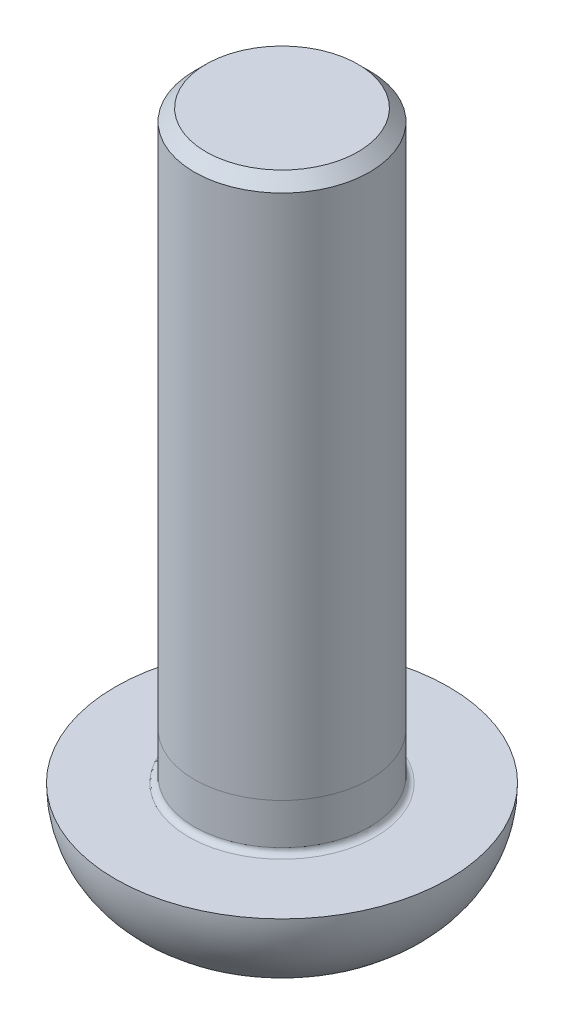
ISO-10303-21;
HEADER;
FILE_DESCRIPTION(('STEP AP214'),'2;1');
FILE_NAME('part.step','',(''),(''),'','','');
FILE_SCHEMA(('AUTOMOTIVE_DESIGN { 1 0 10303 214 1 1 1 1 }'));
ENDSEC;
DATA;
#1=APPLICATION_CONTEXT('core data for automotive mechanical design processes');
#2=APPLICATION_PROTOCOL_DEFINITION('international standard','automotive_design',2000,#1);
#3=PRODUCT_CONTEXT('',#1,'mechanical');
#4=PRODUCT('Part','Part','',(#3));
#5=PRODUCT_RELATED_PRODUCT_CATEGORY('part','',(#4));
#6=PRODUCT_DEFINITION_FORMATION('','',#4);
#7=PRODUCT_DEFINITION_CONTEXT('part definition',#1,'design');
#8=PRODUCT_DEFINITION('design','',#6,#7);
#9=PRODUCT_DEFINITION_SHAPE('','',#8);
#10=(LENGTH_UNIT() NAMED_UNIT(*) SI_UNIT(.MILLI.,.METRE.));
#11=(NAMED_UNIT(*) PLANE_ANGLE_UNIT() SI_UNIT($,.RADIAN.));
#12=(NAMED_UNIT(*) SI_UNIT($,.STERADIAN.) SOLID_ANGLE_UNIT());
#13=UNCERTAINTY_MEASURE_WITH_UNIT(LENGTH_MEASURE(1.E-05),#10,'distance_accuracy_value','');
#14=(GEOMETRIC_REPRESENTATION_CONTEXT(3) GLOBAL_UNCERTAINTY_ASSIGNED_CONTEXT((#13)) GLOBAL_UNIT_ASSIGNED_CONTEXT((#10,
#11,#12)) REPRESENTATION_CONTEXT('',''));
#15=CARTESIAN_POINT('',(0.,0.,0.));
#16=DIRECTION('',(0.,0.,1.));
#17=DIRECTION('',(1.,0.,0.));
#18=AXIS2_PLACEMENT_3D('',#15,#16,#17);
#19=CARTESIAN_POINT('',(0.,0.,0.));
#20=DIRECTION('',(0.,1.,0.));
#21=DIRECTION('',(0.,0.,1.));
#22=AXIS2_PLACEMENT_3D('',#19,#20,#21);
#23=CYLINDRICAL_SURFACE('',#22,1.5);
#24=CARTESIAN_POINT('',(0.,9.8,0.));
#25=DIRECTION('',(0.,1.,0.));
#26=DIRECTION('',(0.,0.,1.));
#27=AXIS2_PLACEMENT_3D('',#24,#25,#26);
#28=CIRCLE('',#27,1.5);
#29=CARTESIAN_POINT('',(0.,9.8,1.5));
#30=VERTEX_POINT('',#29);
#31=EDGE_CURVE('E28',#30,#30,#28,.F.);
#32=ORIENTED_EDGE('',*,*,#31,.T.);
#33=EDGE_LOOP('',(#32));
#34=FACE_BOUND('',#33,.T.);
#35=CARTESIAN_POINT('',(0.,0.8,0.));
#36=DIRECTION('',(0.,1.,0.));
#37=DIRECTION('',(0.,0.,1.));
#38=AXIS2_PLACEMENT_3D('',#35,#36,#37);
#39=CIRCLE('',#38,1.5);
#40=CARTESIAN_POINT('',(0.,0.8,1.5));
#41=VERTEX_POINT('',#40);
#42=EDGE_CURVE('E11',#41,#41,#39,.T.);
#43=ORIENTED_EDGE('',*,*,#42,.T.);
#44=EDGE_LOOP('',(#43));
#45=FACE_BOUND('',#44,.T.);
#46=ADVANCED_FACE('F18',(#34,#45),#23,.T.);
#47=ORIENTED_EDGE('',*,*,#42,.F.);
#48=EDGE_LOOP('',(#47));
#49=FACE_BOUND('',#48,.T.);
#50=CARTESIAN_POINT('',(0.,0.1,0.));
#51=DIRECTION('',(0.,1.,0.));
#52=DIRECTION('',(0.,0.,1.));
#53=AXIS2_PLACEMENT_3D('',#50,#51,#52);
#54=CIRCLE('',#53,1.5);
#55=CARTESIAN_POINT('',(0.,0.1,1.5));
#56=VERTEX_POINT('',#55);
#57=EDGE_CURVE('E280',#56,#56,#54,.T.);
#58=ORIENTED_EDGE('',*,*,#57,.T.);
#59=EDGE_LOOP('',(#58));
#60=FACE_BOUND('',#59,.T.);
#61=ADVANCED_FACE('F192',(#49,#60),#23,.T.);
#62=CARTESIAN_POINT('',(2.85,0.,0.));
#63=DIRECTION('',(0.,1.,0.));
#64=DIRECTION('',(0.,0.,1.));
#65=AXIS2_PLACEMENT_3D('',#62,#63,#64);
#66=PLANE('',#65);
#67=CARTESIAN_POINT('',(0.,0.,0.));
#68=DIRECTION('',(0.,1.,0.));
#69=DIRECTION('',(0.,0.,1.));
#70=AXIS2_PLACEMENT_3D('',#67,#68,#69);
#71=CIRCLE('',#70,1.6);
#72=CARTESIAN_POINT('',(0.,0.,1.6));
#73=VERTEX_POINT('',#72);
#74=EDGE_CURVE('E277',#73,#73,#71,.F.);
#75=ORIENTED_EDGE('',*,*,#74,.T.);
#76=EDGE_LOOP('',(#75));
#77=FACE_BOUND('',#76,.T.);
#78=CARTESIAN_POINT('',(0.,0.,0.));
#79=DIRECTION('',(0.,1.,0.));
#80=DIRECTION('',(0.,0.,1.));
#81=AXIS2_PLACEMENT_3D('',#78,#79,#80);
#82=CIRCLE('',#81,2.85);
#83=CARTESIAN_POINT('',(0.,0.,2.85));
#84=VERTEX_POINT('',#83);
#85=EDGE_CURVE('E108',#84,#84,#82,.T.);
#86=ORIENTED_EDGE('',*,*,#85,.T.);
#87=EDGE_LOOP('',(#86));
#88=FACE_BOUND('',#87,.T.);
#89=ADVANCED_FACE('F199',(#77,#88),#66,.T.);
#90=CARTESIAN_POINT('',(0.,10.,0.));
#91=DIRECTION('',(0.,1.,0.));
#92=DIRECTION('',(0.,0.,1.));
#93=AXIS2_PLACEMENT_3D('',#90,#91,#92);
#94=PLANE('',#93);
#95=CARTESIAN_POINT('',(0.,10.,0.));
#96=DIRECTION('',(0.,1.,0.));
#97=DIRECTION('',(0.,0.,1.));
#98=AXIS2_PLACEMENT_3D('',#95,#96,#97);
#99=CIRCLE('',#98,1.3);
#100=CARTESIAN_POINT('',(0.,10.,1.3));
#101=VERTEX_POINT('',#100);
#102=EDGE_CURVE('E282',#101,#101,#99,.T.);
#103=ORIENTED_EDGE('',*,*,#102,.T.);
#104=EDGE_LOOP('',(#103));
#105=FACE_BOUND('',#104,.T.);
#106=ADVANCED_FACE('F227',(#105),#94,.T.);
#107=CARTESIAN_POINT('',(0.,0.1,0.));
#108=DIRECTION('',(0.,1.,0.));
#109=DIRECTION('',(0.,0.,1.));
#110=AXIS2_PLACEMENT_3D('',#107,#108,#109);
#111=TOROIDAL_SURFACE('',#110,1.6,0.1);
#112=ORIENTED_EDGE('',*,*,#74,.F.);
#113=EDGE_LOOP('',(#112));
#114=FACE_BOUND('',#113,.T.);
#115=ORIENTED_EDGE('',*,*,#57,.F.);
#116=EDGE_LOOP('',(#115));
#117=FACE_BOUND('',#116,.T.);
#118=ADVANCED_FACE('F265',(#114,#117),#111,.F.);
#119=CARTESIAN_POINT('',(0.,10.,0.));
#120=DIRECTION('',(0.,-1.,0.));
#121=DIRECTION('',(0.,0.,-1.));
#122=AXIS2_PLACEMENT_3D('',#119,#120,#121);
#123=CONICAL_SURFACE('',#122,1.3,0.785398163397448);
#124=ORIENTED_EDGE('',*,*,#31,.F.);
#125=EDGE_LOOP('',(#124));
#126=FACE_BOUND('',#125,.T.);
#127=ORIENTED_EDGE('',*,*,#102,.F.);
#128=EDGE_LOOP('',(#127));
#129=FACE_BOUND('',#128,.T.);
#130=ADVANCED_FACE('F21',(#126,#129),#123,.T.);
#131=CARTESIAN_POINT('',(0.,0.,0.));
#132=DIRECTION('',(0.,-1.,0.));
#133=DIRECTION('',(0.,0.,-1.));
#134=AXIS2_PLACEMENT_3D('',#131,#132,#133);
#135=DEGENERATE_TOROIDAL_SURFACE('',#134,1.15723309668695,1.69276690331305,.T.);
#136=ORIENTED_EDGE('',*,*,#85,.F.);
#137=EDGE_LOOP('',(#136));
#138=FACE_BOUND('',#137,.T.);
#139=CARTESIAN_POINT('',(0.,-1.65,0.));
#140=DIRECTION('',(0.,-1.,0.));
#141=DIRECTION('',(0.,0.,-1.));
#142=AXIS2_PLACEMENT_3D('',#139,#140,#141);
#143=CIRCLE('',#142,1.53533333333333);
#144=CARTESIAN_POINT('',(0.,-1.65,-1.53533333333333));
#145=VERTEX_POINT('',#144);
#146=EDGE_CURVE('E119',#145,#145,#143,.T.);
#147=ORIENTED_EDGE('',*,*,#146,.F.);
#148=EDGE_LOOP('',(#147));
#149=FACE_BOUND('',#148,.T.);
#150=ADVANCED_FACE('F143',(#138,#149),#135,.T.);
#151=CARTESIAN_POINT('',(0.,0.343493969566669,0.));
#152=DIRECTION('',(0.,-1.,0.));
#153=DIRECTION('',(0.,0.,-1.));
#154=AXIS2_PLACEMENT_3D('',#151,#152,#153);
#155=CONICAL_SURFACE('',#154,0.,1.0471975511966);
#156=CARTESIAN_POINT('',(0.,0.343493969566668,0.));
#157=VERTEX_POINT('',#156);
#158=VERTEX_LOOP('',#157);
#159=FACE_BOUND('',#158,.T.);
#160=CARTESIAN_POINT('',(-0.57723479913579,-0.323239373765666,1.0002));
#161=CARTESIAN_POINT('',(-0.60260779582055,-0.308581670749146,0.95625268060172));
#162=CARTESIAN_POINT('',(-0.62819980753166,-0.295250420720894,0.911926016050179));
#163=CARTESIAN_POINT('',(-0.679827098330834,-0.271979204723454,0.822504925328877));
#164=CARTESIAN_POINT('',(-0.705863295614161,-0.262047473649781,0.777408908798268));
#165=CARTESIAN_POINT('',(-0.757612978088371,-0.246585391982078,0.68777582947738));
#166=CARTESIAN_POINT('',(-0.783318495222186,-0.240952165198952,0.643252567766779));
#167=CARTESIAN_POINT('',(-0.834850648373674,-0.234223985740253,0.55399626028498));
#168=CARTESIAN_POINT('',(-0.860677096749783,-0.233123465021663,0.509263539518502));
#169=CARTESIAN_POINT('',(-0.908946264126692,-0.235397749398137,0.42565888918265));
#170=CARTESIAN_POINT('',(-0.93139616328756,-0.238214135963409,0.386774523211231));
#171=CARTESIAN_POINT('',(-0.976149681982096,-0.247145147317349,0.309259155014812));
#172=CARTESIAN_POINT('',(-0.998453146411454,-0.253262830854298,0.270628421438359));
#173=CARTESIAN_POINT('',(-1.04329913914046,-0.268558422825822,0.192952883515854));
#174=CARTESIAN_POINT('',(-1.0658359836813,-0.277801249268959,0.153917923728832));
#175=CARTESIAN_POINT('',(-1.11057330008463,-0.298779542855529,0.0764306187239881));
#176=CARTESIAN_POINT('',(-1.13277434629517,-0.310510072233662,0.0379772787061411));
#177=CARTESIAN_POINT('',(-1.15481600843309,-0.323239373765666,-0.000199999999999968));
#178=B_SPLINE_CURVE_WITH_KNOTS('',3,(#160,#161,#162,#163,#164,#165,#166,#167,#168,#169,#170,
#171,#172,#173,#174,#175,#176,#177),.UNSPECIFIED.,.F.,.F.,(4,2,2,2,2,2,2,2,4),(0.,
0.158523820030116,0.317428970089344,0.472400167924636,0.627180939971652,0.762016584872713,
0.896977373984234,1.03493410168667,1.17261952416172),.UNSPECIFIED.);
#179=CARTESIAN_POINT('',(-0.577350269189628,-0.323172697100001,1.));
#180=VERTEX_POINT('',#179);
#181=CARTESIAN_POINT('',(-1.15470053837925,-0.3231726971,0.));
#182=VERTEX_POINT('',#181);
#183=EDGE_CURVE('E231',#180,#182,#178,.T.);
#184=ORIENTED_EDGE('',*,*,#183,.T.);
#185=CARTESIAN_POINT('',(-1.15481600843309,-0.323239373765666,0.000199999999999951));
#186=CARTESIAN_POINT('',(-1.12944301174833,-0.308581670749144,-0.0437473193982796));
#187=CARTESIAN_POINT('',(-1.10385100003722,-0.295250420720892,-0.0880739839498199));
#188=CARTESIAN_POINT('',(-1.05222370923805,-0.271979204723451,-0.177495074671121));
#189=CARTESIAN_POINT('',(-1.02618751195472,-0.262047473649778,-0.222591091201731));
#190=CARTESIAN_POINT('',(-0.974437829480509,-0.246585391982075,-0.312224170522618));
#191=CARTESIAN_POINT('',(-0.948732312346693,-0.240952165198949,-0.356747432233219));
#192=CARTESIAN_POINT('',(-0.897200159195205,-0.23422398574025,-0.446003739715017));
#193=CARTESIAN_POINT('',(-0.871373710819096,-0.233123465021662,-0.490736460481494));
#194=CARTESIAN_POINT('',(-0.823104543442187,-0.235397749398135,-0.574341110817346));
#195=CARTESIAN_POINT('',(-0.800654644281319,-0.238214135963406,-0.613225476788766));
#196=CARTESIAN_POINT('',(-0.755901125586783,-0.247145147317346,-0.690740844985186));
#197=CARTESIAN_POINT('',(-0.733597661157425,-0.253262830854295,-0.729371578561639));
#198=CARTESIAN_POINT('',(-0.688751668428417,-0.268558422825819,-0.807047116484145));
#199=CARTESIAN_POINT('',(-0.666214823887573,-0.277801249268956,-0.846082076271168));
#200=CARTESIAN_POINT('',(-0.621477507484248,-0.298779542855526,-0.923569381276012));
#201=CARTESIAN_POINT('',(-0.599276461273703,-0.31051007223366,-0.962022721293859));
#202=CARTESIAN_POINT('',(-0.577234799135786,-0.323239373765665,-1.0002));
#203=B_SPLINE_CURVE_WITH_KNOTS('',3,(#185,#186,#187,#188,#189,#190,#191,#192,#193,#194,#195,
#196,#197,#198,#199,#200,#201,#202),.UNSPECIFIED.,.F.,.F.,(4,2,2,2,2,2,2,2,4),(0.,
0.158523820030116,0.317428970089343,0.472400167924633,0.627180939971648,0.762016584872712,
0.896977373984234,1.03493410168667,1.17261952416172),.UNSPECIFIED.);
#204=CARTESIAN_POINT('',(-0.577350269189624,-0.323172697099999,-1.));
#205=VERTEX_POINT('',#204);
#206=EDGE_CURVE('E210',#182,#205,#203,.T.);
#207=ORIENTED_EDGE('',*,*,#206,.T.);
#208=CARTESIAN_POINT('',(-2.07504286794707,-0.986393607613955,-1.));
#209=CARTESIAN_POINT('',(-2.02682279106524,-0.961316377407704,-1.));
#210=CARTESIAN_POINT('',(-1.97853691004541,-0.936364946741178,-1.));
#211=CARTESIAN_POINT('',(-1.8818030933017,-0.886774929008181,-1.));
#212=CARTESIAN_POINT('',(-1.83335515294731,-0.862136350978961,-1.));
#213=CARTESIAN_POINT('',(-1.68757772249328,-0.788708866319357,-1.));
#214=CARTESIAN_POINT('',(-1.58996247918061,-0.740485578372843,-1.));
#215=CARTESIAN_POINT('',(-1.38815097133191,-0.643689275610979,-1.));
#216=CARTESIAN_POINT('',(-1.28389118372582,-0.595246614822795,-1.));
#217=CARTESIAN_POINT('',(-1.1261124150131,-0.525795403790139,-1.));
#218=CARTESIAN_POINT('',(-1.07330104577001,-0.503185593765542,-1.));
#219=CARTESIAN_POINT('',(-0.967092503842049,-0.459392656354955,-1.));
#220=CARTESIAN_POINT('',(-0.913695388590406,-0.438209390522896,-1.));
#221=CARTESIAN_POINT('',(-0.799511927621137,-0.395225105347771,-1.));
#222=CARTESIAN_POINT('',(-0.738630513241441,-0.373673326648714,-1.));
#223=CARTESIAN_POINT('',(-0.615756898059116,-0.333895444872872,-1.));
#224=CARTESIAN_POINT('',(-0.55376448427185,-0.315669987124044,-1.));
#225=CARTESIAN_POINT('',(-0.429844956310903,-0.284132130395532,-1.));
#226=CARTESIAN_POINT('',(-0.367941892041247,-0.270727798477079,-0.999999999999999));
#227=CARTESIAN_POINT('',(-0.243186894330264,-0.249688967026314,-1.));
#228=CARTESIAN_POINT('',(-0.180335941994431,-0.242048870164089,-1.));
#229=CARTESIAN_POINT('',(-0.053117087212335,-0.23350346812294,-1.));
#230=CARTESIAN_POINT('',(0.0112587802010998,-0.232710778814144,-0.999999999999999));
#231=CARTESIAN_POINT('',(0.139698917999479,-0.238286345523692,-0.999999999999998));
#232=CARTESIAN_POINT('',(0.203763108167843,-0.244656356253859,-0.999999999999999));
#233=CARTESIAN_POINT('',(0.332282815414209,-0.263811380961667,-0.999999999999998));
#234=CARTESIAN_POINT('',(0.396717517990757,-0.276730366285534,-0.999999999999997));
#235=CARTESIAN_POINT('',(0.524373111070633,-0.307555063618328,-0.999999999999998));
#236=CARTESIAN_POINT('',(0.587593448223018,-0.325462993903571,-1.));
#237=CARTESIAN_POINT('',(0.714393281642094,-0.365369534566214,-1.));
#238=CARTESIAN_POINT('',(0.777944283333139,-0.387456844695104,-0.999999999999998));
#239=CARTESIAN_POINT('',(0.904055464216809,-0.434321064000253,-0.999999999999996));
#240=CARTESIAN_POINT('',(0.966615314988617,-0.459098844162117,-0.999999999999997));
#241=CARTESIAN_POINT('',(1.09101415590376,-0.510600578339333,-0.999999999999997));
#242=CARTESIAN_POINT('',(1.15285213540842,-0.537326951700803,-0.999999999999997));
#243=CARTESIAN_POINT('',(1.27590834026243,-0.592172327957835,-0.999999999999996));
#244=CARTESIAN_POINT('',(1.33712652584108,-0.620291419547209,-0.999999999999996));
#245=CARTESIAN_POINT('',(1.45527281806991,-0.675772911385423,-0.999999999999996));
#246=CARTESIAN_POINT('',(1.51223028309753,-0.703073061852557,-0.999999999999996));
#247=CARTESIAN_POINT('',(1.62580762087008,-0.75837113173608,-0.999999999999996));
#248=CARTESIAN_POINT('',(1.68242747958521,-0.786369079903627,-0.999999999999995));
#249=CARTESIAN_POINT('',(1.79517357157368,-0.842797054453244,-0.999999999999995));
#250=CARTESIAN_POINT('',(1.85130086971277,-0.871224958202004,-0.999999999999994));
#251=CARTESIAN_POINT('',(1.96332854560562,-0.928511693589308,-0.999999999999995));
#252=CARTESIAN_POINT('',(2.01922894445415,-0.957370483944579,-0.999999999999997));
#253=CARTESIAN_POINT('',(2.07504286794707,-0.986393607613955,-1.));
#254=B_SPLINE_CURVE_WITH_KNOTS('',3,(#208,#209,#210,#211,#212,#213,#214,#215,#216,#217,#218,
#219,#220,#221,#222,#223,#224,#225,#226,#227,#228,#229,#230,#231,#232,#233,#234,#235,#236,#237,
#238,#239,#240,#241,#242,#243,#244,#245,#246,#247,#248,#249,#250,#251,#252,#253),.UNSPECIFIED.,
.F.,.F.,(4,2,2,2,2,2,2,2,2,2,2,2,2,2,2,2,2,2,2,2,2,2,4),(0.,0.163053590937593,0.326111881273646,
0.652729035927794,0.997553167692492,1.16988107477401,1.34219223326344,1.53587473946493,
1.72959478148545,1.9193958400875,2.10901235532177,2.3017415782982,2.49451802619509,
2.69140757197867,2.88838480251726,3.09014067143475,3.29196205059307,3.49403842158144,
3.6961276781817,3.88560815647294,4.07509645482261,4.26384234904605,4.45257027410017),.UNSPECIFIED.);
#255=CARTESIAN_POINT('',(0.577350269189627,-0.323172697099999,-1.));
#256=VERTEX_POINT('',#255);
#257=EDGE_CURVE('E106',#205,#256,#254,.T.);
#258=ORIENTED_EDGE('',*,*,#257,.T.);
#259=CARTESIAN_POINT('',(0.577234799135789,-0.323239373765664,-1.0002));
#260=CARTESIAN_POINT('',(0.602607795820549,-0.308581670749144,-0.95625268060172));
#261=CARTESIAN_POINT('',(0.628199807531659,-0.295250420720892,-0.91192601605018));
#262=CARTESIAN_POINT('',(0.679827098330832,-0.271979204723452,-0.822504925328878));
#263=CARTESIAN_POINT('',(0.705863295614159,-0.262047473649779,-0.777408908798268));
#264=CARTESIAN_POINT('',(0.757612978088369,-0.246585391982076,-0.687775829477381));
#265=CARTESIAN_POINT('',(0.783318495222185,-0.24095216519895,-0.64325256776678));
#266=CARTESIAN_POINT('',(0.834850648373672,-0.234223985740251,-0.553996260284982));
#267=CARTESIAN_POINT('',(0.860677096749781,-0.233123465021662,-0.509263539518504));
#268=CARTESIAN_POINT('',(0.90894626412669,-0.235397749398136,-0.425658889182652));
#269=CARTESIAN_POINT('',(0.931396163287558,-0.238214135963407,-0.386774523211232));
#270=CARTESIAN_POINT('',(0.976149681982095,-0.247145147317348,-0.309259155014813));
#271=CARTESIAN_POINT('',(0.998453146411452,-0.253262830854298,-0.27062842143836));
#272=CARTESIAN_POINT('',(1.04329913914046,-0.268558422825821,-0.192952883515854));
#273=CARTESIAN_POINT('',(1.0658359836813,-0.277801249268958,-0.153917923728831));
#274=CARTESIAN_POINT('',(1.11057330008463,-0.298779542855528,-0.0764306187239868));
#275=CARTESIAN_POINT('',(1.13277434629517,-0.310510072233661,-0.0379772787061394));
#276=CARTESIAN_POINT('',(1.15481600843309,-0.323239373765666,0.000200000000001659));
#277=B_SPLINE_CURVE_WITH_KNOTS('',3,(#259,#260,#261,#262,#263,#264,#265,#266,#267,#268,#269,
#270,#271,#272,#273,#274,#275,#276),.UNSPECIFIED.,.F.,.F.,(4,2,2,2,2,2,2,2,4),(0.,
0.158523820030116,0.317428970089343,0.472400167924634,0.627180939971649,0.762016584872712,
0.896977373984234,1.03493410168667,1.17261952416172),.UNSPECIFIED.);
#278=CARTESIAN_POINT('',(1.15470053837925,-0.3231726971,0.));
#279=VERTEX_POINT('',#278);
#280=EDGE_CURVE('E255',#256,#279,#277,.T.);
#281=ORIENTED_EDGE('',*,*,#280,.T.);
#282=CARTESIAN_POINT('',(1.15481600843309,-0.323239373765666,-0.000199999999998299));
#283=CARTESIAN_POINT('',(1.12944301174833,-0.308581670749145,0.0437473193982811));
#284=CARTESIAN_POINT('',(1.10385100003722,-0.295250420720892,0.0880739839498212));
#285=CARTESIAN_POINT('',(1.05222370923805,-0.271979204723452,0.177495074671123));
#286=CARTESIAN_POINT('',(1.02618751195472,-0.262047473649779,0.222591091201732));
#287=CARTESIAN_POINT('',(0.974437829480509,-0.246585391982076,0.31222417052262));
#288=CARTESIAN_POINT('',(0.948732312346694,-0.240952165198951,0.356747432233221));
#289=CARTESIAN_POINT('',(0.897200159195205,-0.234223985740251,0.446003739715018));
#290=CARTESIAN_POINT('',(0.871373710819094,-0.233123465021662,0.490736460481495));
#291=CARTESIAN_POINT('',(0.823104543442185,-0.235397749398136,0.574341110817347));
#292=CARTESIAN_POINT('',(0.800654644281318,-0.238214135963407,0.613225476788768));
#293=CARTESIAN_POINT('',(0.755901125586783,-0.247145147317348,0.690740844985188));
#294=CARTESIAN_POINT('',(0.733597661157425,-0.253262830854297,0.729371578561641));
#295=CARTESIAN_POINT('',(0.688751668428417,-0.268558422825821,0.807047116484147));
#296=CARTESIAN_POINT('',(0.666214823887573,-0.277801249268958,0.846082076271169));
#297=CARTESIAN_POINT('',(0.621477507484247,-0.298779542855529,0.923569381276014));
#298=CARTESIAN_POINT('',(0.599276461273702,-0.310510072233662,0.96202272129386));
#299=CARTESIAN_POINT('',(0.577234799135783,-0.323239373765666,1.0002));
#300=B_SPLINE_CURVE_WITH_KNOTS('',3,(#282,#283,#284,#285,#286,#287,#288,#289,#290,#291,#292,
#293,#294,#295,#296,#297,#298,#299),.UNSPECIFIED.,.F.,.F.,(4,2,2,2,2,2,2,2,4),(0.,
0.158523820030116,0.317428970089343,0.472400167924634,0.627180939971649,0.762016584872712,
0.896977373984235,1.03493410168667,1.17261952416172),.UNSPECIFIED.);
#301=CARTESIAN_POINT('',(0.577350269189621,-0.323172697100001,1.));
#302=VERTEX_POINT('',#301);
#303=EDGE_CURVE('E249',#279,#302,#300,.T.);
#304=ORIENTED_EDGE('',*,*,#303,.T.);
#305=CARTESIAN_POINT('',(2.07504286794707,-0.986393607613953,1.));
#306=CARTESIAN_POINT('',(2.02682279106523,-0.961316377407702,1.));
#307=CARTESIAN_POINT('',(1.97853691004541,-0.936364946741176,1.));
#308=CARTESIAN_POINT('',(1.8818030933017,-0.886774929008179,1.));
#309=CARTESIAN_POINT('',(1.83335515294731,-0.862136350978959,1.));
#310=CARTESIAN_POINT('',(1.68757772249327,-0.788708866319355,1.));
#311=CARTESIAN_POINT('',(1.58996247918061,-0.740485578372841,1.));
#312=CARTESIAN_POINT('',(1.3881509713319,-0.643689275610978,1.));
#313=CARTESIAN_POINT('',(1.28389118372581,-0.595246614822793,1.));
#314=CARTESIAN_POINT('',(1.12611241501309,-0.525795403790138,1.));
#315=CARTESIAN_POINT('',(1.07330104577001,-0.503185593765541,1.));
#316=CARTESIAN_POINT('',(0.967092503842044,-0.459392656354954,1.));
#317=CARTESIAN_POINT('',(0.9136953885904,-0.438209390522895,1.));
#318=CARTESIAN_POINT('',(0.799511927621131,-0.39522510534777,1.));
#319=CARTESIAN_POINT('',(0.738630513241435,-0.373673326648713,1.));
#320=CARTESIAN_POINT('',(0.615756898059109,-0.333895444872871,1.));
#321=CARTESIAN_POINT('',(0.553764484271844,-0.315669987124044,1.));
#322=CARTESIAN_POINT('',(0.429844956310896,-0.284132130395532,1.));
#323=CARTESIAN_POINT('',(0.36794189204124,-0.270727798477079,0.999999999999999));
#324=CARTESIAN_POINT('',(0.243186894330257,-0.249688967026315,1.));
#325=CARTESIAN_POINT('',(0.180335941994423,-0.24204887016409,1.));
#326=CARTESIAN_POINT('',(0.0531170872123265,-0.233503468122942,1.));
#327=CARTESIAN_POINT('',(-0.0112587802011085,-0.232710778814146,0.999999999999999));
#328=CARTESIAN_POINT('',(-0.139698917999488,-0.238286345523695,0.999999999999998));
#329=CARTESIAN_POINT('',(-0.203763108167852,-0.244656356253862,0.999999999999999));
#330=CARTESIAN_POINT('',(-0.332282815414218,-0.26381138096167,0.999999999999998));
#331=CARTESIAN_POINT('',(-0.396717517990766,-0.276730366285537,0.999999999999997));
#332=CARTESIAN_POINT('',(-0.524373111070641,-0.307555063618332,0.999999999999998));
#333=CARTESIAN_POINT('',(-0.587593448223027,-0.325462993903575,1.));
#334=CARTESIAN_POINT('',(-0.714393281642102,-0.365369534566218,1.));
#335=CARTESIAN_POINT('',(-0.777944283333146,-0.387456844695108,0.999999999999998));
#336=CARTESIAN_POINT('',(-0.904055464216816,-0.434321064000257,0.999999999999996));
#337=CARTESIAN_POINT('',(-0.966615314988624,-0.459098844162121,0.999999999999997));
#338=CARTESIAN_POINT('',(-1.09101415590376,-0.510600578339336,0.999999999999997));
#339=CARTESIAN_POINT('',(-1.15285213540842,-0.537326951700806,0.999999999999997));
#340=CARTESIAN_POINT('',(-1.27590834026244,-0.592172327957838,0.999999999999996));
#341=CARTESIAN_POINT('',(-1.33712652584108,-0.620291419547212,0.999999999999996));
#342=CARTESIAN_POINT('',(-1.45527281806991,-0.675772911385425,0.999999999999996));
#343=CARTESIAN_POINT('',(-1.51223028309753,-0.703073061852559,0.999999999999996));
#344=CARTESIAN_POINT('',(-1.62580762087008,-0.758371131736082,0.999999999999996));
#345=CARTESIAN_POINT('',(-1.68242747958521,-0.786369079903628,0.999999999999995));
#346=CARTESIAN_POINT('',(-1.79517357157368,-0.842797054453244,0.999999999999995));
#347=CARTESIAN_POINT('',(-1.85130086971277,-0.871224958202004,0.999999999999994));
#348=CARTESIAN_POINT('',(-1.96332854560562,-0.928511693589307,0.999999999999995));
#349=CARTESIAN_POINT('',(-2.01922894445415,-0.957370483944578,0.999999999999997));
#350=CARTESIAN_POINT('',(-2.07504286794707,-0.986393607613954,1.));
#351=B_SPLINE_CURVE_WITH_KNOTS('',3,(#305,#306,#307,#308,#309,#310,#311,#312,#313,#314,#315,
#316,#317,#318,#319,#320,#321,#322,#323,#324,#325,#326,#327,#328,#329,#330,#331,#332,#333,#334,
#335,#336,#337,#338,#339,#340,#341,#342,#343,#344,#345,#346,#347,#348,#349,#350),.UNSPECIFIED.,
.F.,.F.,(4,2,2,2,2,2,2,2,2,2,2,2,2,2,2,2,2,2,2,2,2,2,4),(0.,0.163053590937593,0.326111881273647,
0.652729035927794,0.997553167692493,1.16988107477402,1.34219223326344,1.53587473946493,
1.72959478148545,1.9193958400875,2.10901235532177,2.3017415782982,2.4945180261951,
2.69140757197867,2.88838480251727,3.09014067143475,3.29196205059307,3.49403842158144,
3.6961276781817,3.88560815647294,4.0750964548226,4.26384234904604,4.45257027410017),.UNSPECIFIED.);
#352=EDGE_CURVE('E241',#302,#180,#351,.T.);
#353=ORIENTED_EDGE('',*,*,#352,.T.);
#354=EDGE_LOOP('',(#184,#207,#258,#281,#304,#353));
#355=FACE_BOUND('',#354,.T.);
#356=ADVANCED_FACE('F176',(#159,#355),#155,.F.);
#357=CARTESIAN_POINT('',(-0.577350269189624,12.5169509775392,-1.));
#358=DIRECTION('',(0.,0.,-1.));
#359=DIRECTION('',(-1.,0.,0.));
#360=AXIS2_PLACEMENT_3D('',#357,#358,#359);
#361=PLANE('',#360);
#362=CARTESIAN_POINT('',(1.77298423208036,-1.88602351298946,-1.));
#363=CARTESIAN_POINT('',(1.6875314224142,-1.86610755280139,-0.999999999999997));
#364=CARTESIAN_POINT('',(1.60200905768685,-1.84647117573885,-0.999999999999996));
#365=CARTESIAN_POINT('',(1.43073686786515,-1.80814400188846,-0.999999999999995));
#366=CARTESIAN_POINT('',(1.34498700367298,-1.78945338043572,-0.999999999999996));
#367=CARTESIAN_POINT('',(1.17236724871317,-1.7532364347891,-0.999999999999997));
#368=CARTESIAN_POINT('',(1.08549457829007,-1.73572320874417,-0.999999999999997));
#369=CARTESIAN_POINT('',(0.91134459775987,-1.70275076109791,-0.999999999999997));
#370=CARTESIAN_POINT('',(0.824067248828772,-1.68729174097644,-0.999999999999997));
#371=CARTESIAN_POINT('',(0.65141232127326,-1.65985747064075,-0.999999999999997));
#372=CARTESIAN_POINT('',(0.566048482649787,-1.64779812562985,-0.999999999999998));
#373=CARTESIAN_POINT('',(0.394830671520815,-1.62793838834702,-0.999999999999998));
#374=CARTESIAN_POINT('',(0.308976866107436,-1.62013662268202,-0.999999999999998));
#375=CARTESIAN_POINT('',(0.137316891887317,-1.6101398908392,-0.999999999999999));
#376=CARTESIAN_POINT('',(0.0515123087773134,-1.60791938694073,-0.999999999999999));
#377=CARTESIAN_POINT('',(-0.120045439178876,-1.6094913772906,-0.999999999999999));
#378=CARTESIAN_POINT('',(-0.205798600005085,-1.61328429248403,-1.));
#379=CARTESIAN_POINT('',(-0.353235352876963,-1.6243218351492,-1.));
#380=CARTESIAN_POINT('',(-0.415019607826427,-1.63032243172349,-1.));
#381=CARTESIAN_POINT('',(-0.538326391137577,-1.64454275255695,-1.));
#382=CARTESIAN_POINT('',(-0.599848925851934,-1.6527624226373,-1.));
#383=CARTESIAN_POINT('',(-0.784439968830874,-1.68002530242935,-1.));
#384=CARTESIAN_POINT('',(-0.907124209554365,-1.7016350390604,-1.));
#385=CARTESIAN_POINT('',(-1.09186138946571,-1.73715751580357,-1.));
#386=CARTESIAN_POINT('',(-1.15420316731235,-1.74966142848525,-1.));
#387=CARTESIAN_POINT('',(-1.2787312397021,-1.77543472468398,-1.));
#388=CARTESIAN_POINT('',(-1.3409175323186,-1.78870411763755,-1.));
#389=CARTESIAN_POINT('',(-1.46480859225419,-1.81573712068565,-1.));
#390=CARTESIAN_POINT('',(-1.5265140790948,-1.8294974692351,-1.));
#391=CARTESIAN_POINT('',(-1.64982040352173,-1.85745975284115,-1.));
#392=CARTESIAN_POINT('',(-1.71142124831725,-1.87166165605846,-1.));
#393=CARTESIAN_POINT('',(-1.77298423208036,-1.88602351298946,-1.));
#394=B_SPLINE_CURVE_WITH_KNOTS('',3,(#362,#363,#364,#365,#366,#367,#368,#369,#370,#371,#372,
#373,#374,#375,#376,#377,#378,#379,#380,#381,#382,#383,#384,#385,#386,#387,#388,#389,#390,#391,
#392,#393),.UNSPECIFIED.,.F.,.F.,(4,2,2,2,2,2,2,2,2,2,2,2,2,2,2,4),(0.,0.263234945820971,
0.52651851570911,0.792363841842592,1.0582352233017,1.31679695808678,1.5752752376771,
1.83256864859682,2.08988007109644,2.27606085771811,2.462237099135,2.83581575293878,
3.02656672097944,3.21732004101871,3.40698211336698,3.59663054127773),.UNSPECIFIED.);
#395=CARTESIAN_POINT('',(0.57735026918962,-1.65,-1.));
#396=VERTEX_POINT('',#395);
#397=CARTESIAN_POINT('',(-0.577350269189628,-1.65,-1.));
#398=VERTEX_POINT('',#397);
#399=EDGE_CURVE('E87',#396,#398,#394,.T.);
#400=ORIENTED_EDGE('',*,*,#399,.F.);
#401=DIRECTION('',(0.,-1.,0.));
#402=VECTOR('',#401,1.);
#403=CARTESIAN_POINT('',(0.577350269189627,12.5169509775392,-1.));
#404=LINE('',#403,#402);
#405=EDGE_CURVE('E109',#256,#396,#404,.T.);
#406=ORIENTED_EDGE('',*,*,#405,.F.);
#407=ORIENTED_EDGE('',*,*,#257,.F.);
#408=DIRECTION('',(0.,-1.,0.));
#409=VECTOR('',#408,1.);
#410=CARTESIAN_POINT('',(-0.577350269189624,12.5169509775392,-1.));
#411=LINE('',#410,#409);
#412=EDGE_CURVE('E99',#205,#398,#411,.T.);
#413=ORIENTED_EDGE('',*,*,#412,.T.);
#414=EDGE_LOOP('',(#400,#406,#407,#413));
#415=FACE_BOUND('',#414,.T.);
#416=ADVANCED_FACE('F104',(#415),#361,.F.);
#417=CARTESIAN_POINT('',(0.577350269189627,12.5169509775392,-1.));
#418=DIRECTION('',(0.866025403784439,0.,-0.5));
#419=DIRECTION('',(-0.5,0.,-0.86602540378444));
#420=AXIS2_PLACEMENT_3D('',#417,#418,#419);
#421=PLANE('',#420);
#422=CARTESIAN_POINT('',(1.15481600843309,-1.65003094474823,0.000200000000001734));
#423=CARTESIAN_POINT('',(1.13083054982755,-1.64359970627136,-0.0413440329476325));
#424=CARTESIAN_POINT('',(1.10680158691088,-1.63776108324611,-0.0829634175725025));
#425=CARTESIAN_POINT('',(1.05865875469988,-1.62750302526799,-0.166349248982214));
#426=CARTESIAN_POINT('',(1.03454485489538,-1.62308416744664,-0.20811574861223));
#427=CARTESIAN_POINT('',(0.986378434602868,-1.61592373892737,-0.29154243577758));
#428=CARTESIAN_POINT('',(0.962326240203119,-1.61317362448467,-0.333202058511468));
#429=CARTESIAN_POINT('',(0.914191160563777,-1.60948598841594,-0.416574462073182));
#430=CARTESIAN_POINT('',(0.890108282174109,-1.60854811567262,-0.458287231036591));
#431=CARTESIAN_POINT('',(0.841942525394771,-1.60854811567262,-0.541712768963408));
#432=CARTESIAN_POINT('',(0.817859647005103,-1.60948598841594,-0.583425537926817));
#433=CARTESIAN_POINT('',(0.769724567365761,-1.61317362448467,-0.666797941488531));
#434=CARTESIAN_POINT('',(0.745672372966013,-1.61592373892737,-0.708457564222419));
#435=CARTESIAN_POINT('',(0.697505952673499,-1.62308416744664,-0.791884251387769));
#436=CARTESIAN_POINT('',(0.673392052869001,-1.62750302526799,-0.833650751017785));
#437=CARTESIAN_POINT('',(0.625249220658003,-1.63776108324611,-0.917036582427496));
#438=CARTESIAN_POINT('',(0.601220257741328,-1.64359970627136,-0.958655967052366));
#439=CARTESIAN_POINT('',(0.577234799135789,-1.65003094474823,-1.0002));
#440=B_SPLINE_CURVE_WITH_KNOTS('',3,(#422,#423,#424,#425,#426,#427,#428,#429,#430,#431,#432,
#433,#434,#435,#436,#437,#438,#439),.UNSPECIFIED.,.F.,.F.,(4,2,2,2,2,2,2,2,4),(0.,
0.145207919576138,0.290474791401638,0.434991498754473,0.579480203548905,0.723968908343338,
0.868485615696173,1.01375248752167,1.15896040709781),.UNSPECIFIED.);
#441=CARTESIAN_POINT('',(1.15470053837926,-1.65,0.));
#442=VERTEX_POINT('',#441);
#443=EDGE_CURVE('E94',#442,#396,#440,.T.);
#444=ORIENTED_EDGE('',*,*,#443,.F.);
#445=DIRECTION('',(0.,-1.,0.));
#446=VECTOR('',#445,1.);
#447=CARTESIAN_POINT('',(1.15470053837925,12.5169509775392,0.));
#448=LINE('',#447,#446);
#449=EDGE_CURVE('E313',#279,#442,#448,.T.);
#450=ORIENTED_EDGE('',*,*,#449,.F.);
#451=ORIENTED_EDGE('',*,*,#280,.F.);
#452=ORIENTED_EDGE('',*,*,#405,.T.);
#453=EDGE_LOOP('',(#444,#450,#451,#452));
#454=FACE_BOUND('',#453,.T.);
#455=ADVANCED_FACE('F175',(#454),#421,.F.);
#456=CARTESIAN_POINT('',(1.15470053837925,12.5169509775392,0.));
#457=DIRECTION('',(0.866025403784437,0.,0.5));
#458=DIRECTION('',(0.5,0.,-0.866025403784437));
#459=AXIS2_PLACEMENT_3D('',#456,#457,#458);
#460=PLANE('',#459);
#461=CARTESIAN_POINT('',(0.577234799135783,-1.65003094474823,1.0002));
#462=CARTESIAN_POINT('',(0.601220257741324,-1.64359970627136,0.958655967052367));
#463=CARTESIAN_POINT('',(0.625249220658,-1.63776108324611,0.917036582427498));
#464=CARTESIAN_POINT('',(0.673392052868998,-1.62750302526799,0.833650751017787));
#465=CARTESIAN_POINT('',(0.697505952673496,-1.62308416744664,0.791884251387771));
#466=CARTESIAN_POINT('',(0.745672372966009,-1.61592373892737,0.70845756422242));
#467=CARTESIAN_POINT('',(0.769724567365758,-1.61317362448467,0.666797941488532));
#468=CARTESIAN_POINT('',(0.8178596470051,-1.60948598841594,0.583425537926819));
#469=CARTESIAN_POINT('',(0.841942525394768,-1.60854811567262,0.54171276896341));
#470=CARTESIAN_POINT('',(0.890108282174106,-1.60854811567262,0.458287231036592));
#471=CARTESIAN_POINT('',(0.914191160563775,-1.60948598841594,0.416574462073184));
#472=CARTESIAN_POINT('',(0.962326240203116,-1.61317362448467,0.33320205851147));
#473=CARTESIAN_POINT('',(0.986378434602865,-1.61592373892737,0.291542435777582));
#474=CARTESIAN_POINT('',(1.03454485489538,-1.62308416744664,0.208115748612232));
#475=CARTESIAN_POINT('',(1.05865875469988,-1.62750302526799,0.166349248982216));
#476=CARTESIAN_POINT('',(1.10680158691087,-1.63776108324611,0.0829634175725046));
#477=CARTESIAN_POINT('',(1.13083054982755,-1.64359970627136,0.0413440329476349));
#478=CARTESIAN_POINT('',(1.15481600843309,-1.65003094474823,-0.000199999999998297));
#479=B_SPLINE_CURVE_WITH_KNOTS('',3,(#461,#462,#463,#464,#465,#466,#467,#468,#469,#470,#471,
#472,#473,#474,#475,#476,#477,#478),.UNSPECIFIED.,.F.,.F.,(4,2,2,2,2,2,2,2,4),(0.,
0.145207919576138,0.290474791401638,0.434991498754473,0.579480203548905,0.723968908343338,
0.868485615696173,1.01375248752167,1.15896040709781),.UNSPECIFIED.);
#480=CARTESIAN_POINT('',(0.577350269189636,-1.65,1.));
#481=VERTEX_POINT('',#480);
#482=EDGE_CURVE('E128',#481,#442,#479,.T.);
#483=ORIENTED_EDGE('',*,*,#482,.F.);
#484=DIRECTION('',(0.,-1.,0.));
#485=VECTOR('',#484,1.);
#486=CARTESIAN_POINT('',(0.577350269189621,12.5169509775392,1.));
#487=LINE('',#486,#485);
#488=EDGE_CURVE('E310',#302,#481,#487,.T.);
#489=ORIENTED_EDGE('',*,*,#488,.F.);
#490=ORIENTED_EDGE('',*,*,#303,.F.);
#491=ORIENTED_EDGE('',*,*,#449,.T.);
#492=EDGE_LOOP('',(#483,#489,#490,#491));
#493=FACE_BOUND('',#492,.T.);
#494=ADVANCED_FACE('F179',(#493),#460,.F.);
#495=CARTESIAN_POINT('',(0.577350269189621,12.5169509775392,1.));
#496=DIRECTION('',(0.,0.,1.));
#497=DIRECTION('',(1.,0.,0.));
#498=AXIS2_PLACEMENT_3D('',#495,#496,#497);
#499=PLANE('',#498);
#500=CARTESIAN_POINT('',(-1.77298423208036,-1.88602351298946,1.));
#501=CARTESIAN_POINT('',(-1.6875314224142,-1.86610755280139,0.999999999999997));
#502=CARTESIAN_POINT('',(-1.60200905768685,-1.84647117573885,0.999999999999996));
#503=CARTESIAN_POINT('',(-1.43073686786515,-1.80814400188846,0.999999999999995));
#504=CARTESIAN_POINT('',(-1.34498700367298,-1.78945338043571,0.999999999999996));
#505=CARTESIAN_POINT('',(-1.17236724871316,-1.7532364347891,0.999999999999997));
#506=CARTESIAN_POINT('',(-1.08549457829007,-1.73572320874417,0.999999999999997));
#507=CARTESIAN_POINT('',(-0.911344597759866,-1.70275076109791,0.999999999999997));
#508=CARTESIAN_POINT('',(-0.824067248828768,-1.68729174097644,0.999999999999997));
#509=CARTESIAN_POINT('',(-0.651412321273256,-1.65985747064075,0.999999999999997));
#510=CARTESIAN_POINT('',(-0.566048482649783,-1.64779812562985,0.999999999999998));
#511=CARTESIAN_POINT('',(-0.39483067152081,-1.62793838834701,0.999999999999998));
#512=CARTESIAN_POINT('',(-0.308976866107431,-1.62013662268202,0.999999999999998));
#513=CARTESIAN_POINT('',(-0.137316891887311,-1.6101398908392,0.999999999999999));
#514=CARTESIAN_POINT('',(-0.0515123087773069,-1.60791938694073,0.999999999999999));
#515=CARTESIAN_POINT('',(0.120045439178883,-1.60949137729061,0.999999999999999));
#516=CARTESIAN_POINT('',(0.205798600005092,-1.61328429248404,1.));
#517=CARTESIAN_POINT('',(0.353235352876971,-1.6243218351492,1.));
#518=CARTESIAN_POINT('',(0.415019607826435,-1.63032243172349,1.));
#519=CARTESIAN_POINT('',(0.538326391137584,-1.64454275255695,1.));
#520=CARTESIAN_POINT('',(0.59984892585194,-1.6527624226373,1.));
#521=CARTESIAN_POINT('',(0.784439968830878,-1.68002530242936,1.));
#522=CARTESIAN_POINT('',(0.907124209554368,-1.7016350390604,1.));
#523=CARTESIAN_POINT('',(1.09186138946571,-1.73715751580357,1.));
#524=CARTESIAN_POINT('',(1.15420316731235,-1.74966142848525,1.));
#525=CARTESIAN_POINT('',(1.2787312397021,-1.77543472468399,1.));
#526=CARTESIAN_POINT('',(1.3409175323186,-1.78870411763755,1.));
#527=CARTESIAN_POINT('',(1.46480859225419,-1.81573712068566,1.));
#528=CARTESIAN_POINT('',(1.52651407909479,-1.8294974692351,1.));
#529=CARTESIAN_POINT('',(1.64982040352172,-1.85745975284115,1.));
#530=CARTESIAN_POINT('',(1.71142124831724,-1.87166165605846,1.));
#531=CARTESIAN_POINT('',(1.77298423208036,-1.88602351298946,1.));
#532=B_SPLINE_CURVE_WITH_KNOTS('',3,(#500,#501,#502,#503,#504,#505,#506,#507,#508,#509,#510,
#511,#512,#513,#514,#515,#516,#517,#518,#519,#520,#521,#522,#523,#524,#525,#526,#527,#528,#529,
#530,#531),.UNSPECIFIED.,.F.,.F.,(4,2,2,2,2,2,2,2,2,2,2,2,2,2,2,4),(0.,0.263234945820972,
0.526518515709112,0.792363841842594,1.05823522330171,1.31679695808678,1.57527523767711,
1.83256864859682,2.08988007109645,2.27606085771812,2.462237099135,2.83581575293878,
3.02656672097944,3.2173200410187,3.40698211336697,3.59663054127772),.UNSPECIFIED.);
#533=CARTESIAN_POINT('',(-0.577350269189628,-1.65,1.));
#534=VERTEX_POINT('',#533);
#535=EDGE_CURVE('E81',#534,#481,#532,.T.);
#536=ORIENTED_EDGE('',*,*,#535,.F.);
#537=DIRECTION('',(0.,-1.,0.));
#538=VECTOR('',#537,1.);
#539=CARTESIAN_POINT('',(-0.577350269189628,12.5169509775392,1.));
#540=LINE('',#539,#538);
#541=EDGE_CURVE('E42',#180,#534,#540,.T.);
#542=ORIENTED_EDGE('',*,*,#541,.F.);
#543=ORIENTED_EDGE('',*,*,#352,.F.);
#544=ORIENTED_EDGE('',*,*,#488,.T.);
#545=EDGE_LOOP('',(#536,#542,#543,#544));
#546=FACE_BOUND('',#545,.T.);
#547=ADVANCED_FACE('F135',(#546),#499,.F.);
#548=CARTESIAN_POINT('',(-0.577350269189628,12.5169509775392,1.));
#549=DIRECTION('',(-0.866025403784439,0.,0.5));
#550=DIRECTION('',(0.5,0.,0.86602540378444));
#551=AXIS2_PLACEMENT_3D('',#548,#549,#550);
#552=PLANE('',#551);
#553=CARTESIAN_POINT('',(-1.15481600843309,-1.65003094474823,-0.00020000000000007));
#554=CARTESIAN_POINT('',(-1.13083054982755,-1.64359970627136,0.041344032947634));
#555=CARTESIAN_POINT('',(-1.10680158691088,-1.63776108324611,0.0829634175725041));
#556=CARTESIAN_POINT('',(-1.05865875469988,-1.62750302526799,0.166349248982215));
#557=CARTESIAN_POINT('',(-1.03454485489538,-1.62308416744664,0.208115748612231));
#558=CARTESIAN_POINT('',(-0.986378434602868,-1.61592373892737,0.291542435777581));
#559=CARTESIAN_POINT('',(-0.96232624020312,-1.61317362448467,0.333202058511469));
#560=CARTESIAN_POINT('',(-0.914191160563778,-1.60948598841594,0.416574462073183));
#561=CARTESIAN_POINT('',(-0.890108282174109,-1.60854811567262,0.458287231036592));
#562=CARTESIAN_POINT('',(-0.841942525394772,-1.60854811567262,0.541712768963409));
#563=CARTESIAN_POINT('',(-0.817859647005103,-1.60948598841594,0.583425537926818));
#564=CARTESIAN_POINT('',(-0.769724567365762,-1.61317362448467,0.666797941488531));
#565=CARTESIAN_POINT('',(-0.745672372966014,-1.61592373892737,0.708457564222419));
#566=CARTESIAN_POINT('',(-0.6975059526735,-1.62308416744664,0.791884251387769));
#567=CARTESIAN_POINT('',(-0.673392052869002,-1.62750302526799,0.833650751017785));
#568=CARTESIAN_POINT('',(-0.625249220658004,-1.63776108324611,0.917036582427496));
#569=CARTESIAN_POINT('',(-0.601220257741329,-1.64359970627136,0.958655967052366));
#570=CARTESIAN_POINT('',(-0.57723479913579,-1.65003094474823,1.0002));
#571=B_SPLINE_CURVE_WITH_KNOTS('',3,(#553,#554,#555,#556,#557,#558,#559,#560,#561,#562,#563,
#564,#565,#566,#567,#568,#569,#570),.UNSPECIFIED.,.F.,.F.,(4,2,2,2,2,2,2,2,4),(0.,
0.145207919576138,0.290474791401638,0.434991498754472,0.579480203548905,0.723968908343337,
0.868485615696171,1.01375248752167,1.15896040709781),.UNSPECIFIED.);
#572=CARTESIAN_POINT('',(-1.15470053837925,-1.65,0.));
#573=VERTEX_POINT('',#572);
#574=EDGE_CURVE('E149',#573,#534,#571,.T.);
#575=ORIENTED_EDGE('',*,*,#574,.F.);
#576=DIRECTION('',(0.,-1.,0.));
#577=VECTOR('',#576,1.);
#578=CARTESIAN_POINT('',(-1.15470053837925,12.5169509775392,0.));
#579=LINE('',#578,#577);
#580=EDGE_CURVE('E102',#182,#573,#579,.T.);
#581=ORIENTED_EDGE('',*,*,#580,.F.);
#582=ORIENTED_EDGE('',*,*,#183,.F.);
#583=ORIENTED_EDGE('',*,*,#541,.T.);
#584=EDGE_LOOP('',(#575,#581,#582,#583));
#585=FACE_BOUND('',#584,.T.);
#586=ADVANCED_FACE('F188',(#585),#552,.F.);
#587=CARTESIAN_POINT('',(-1.15470053837925,12.5169509775392,0.));
#588=DIRECTION('',(-0.866025403784438,0.,-0.5));
#589=DIRECTION('',(-0.5,0.,0.866025403784439));
#590=AXIS2_PLACEMENT_3D('',#587,#588,#589);
#591=PLANE('',#590);
#592=CARTESIAN_POINT('',(-0.577234799135786,-1.65003094474823,-1.0002));
#593=CARTESIAN_POINT('',(-0.601220257741325,-1.64359970627136,-0.958655967052366));
#594=CARTESIAN_POINT('',(-0.625249220658,-1.63776108324611,-0.917036582427496));
#595=CARTESIAN_POINT('',(-0.673392052868998,-1.62750302526799,-0.833650751017785));
#596=CARTESIAN_POINT('',(-0.697505952673496,-1.62308416744664,-0.791884251387769));
#597=CARTESIAN_POINT('',(-0.74567237296601,-1.61592373892736,-0.708457564222419));
#598=CARTESIAN_POINT('',(-0.769724567365758,-1.61317362448467,-0.666797941488531));
#599=CARTESIAN_POINT('',(-0.817859647005099,-1.60948598841594,-0.583425537926817));
#600=CARTESIAN_POINT('',(-0.841942525394768,-1.60854811567262,-0.541712768963409));
#601=CARTESIAN_POINT('',(-0.890108282174106,-1.60854811567262,-0.458287231036591));
#602=CARTESIAN_POINT('',(-0.914191160563774,-1.60948598841594,-0.416574462073183));
#603=CARTESIAN_POINT('',(-0.962326240203116,-1.61317362448467,-0.333202058511469));
#604=CARTESIAN_POINT('',(-0.986378434602864,-1.61592373892736,-0.291542435777581));
#605=CARTESIAN_POINT('',(-1.03454485489538,-1.62308416744664,-0.208115748612231));
#606=CARTESIAN_POINT('',(-1.05865875469988,-1.62750302526799,-0.166349248982215));
#607=CARTESIAN_POINT('',(-1.10680158691087,-1.63776108324611,-0.0829634175725038));
#608=CARTESIAN_POINT('',(-1.13083054982755,-1.64359970627136,-0.0413440329476339));
#609=CARTESIAN_POINT('',(-1.15481600843309,-1.65003094474823,0.000199999999999651));
#610=B_SPLINE_CURVE_WITH_KNOTS('',3,(#592,#593,#594,#595,#596,#597,#598,#599,#600,#601,#602,
#603,#604,#605,#606,#607,#608,#609),.UNSPECIFIED.,.F.,.F.,(4,2,2,2,2,2,2,2,4),(0.,
0.145207919576138,0.290474791401638,0.434991498754473,0.579480203548905,0.723968908343337,
0.868485615696172,1.01375248752167,1.15896040709781),.UNSPECIFIED.);
#611=EDGE_CURVE('E34',#398,#573,#610,.T.);
#612=ORIENTED_EDGE('',*,*,#611,.F.);
#613=ORIENTED_EDGE('',*,*,#412,.F.);
#614=ORIENTED_EDGE('',*,*,#206,.F.);
#615=ORIENTED_EDGE('',*,*,#580,.T.);
#616=EDGE_LOOP('',(#612,#613,#614,#615));
#617=FACE_BOUND('',#616,.T.);
#618=ADVANCED_FACE('F98',(#617),#591,.F.);
#619=CARTESIAN_POINT('',(0.,-1.3405989232415,0.));
#620=DIRECTION('',(0.,-1.,0.));
#621=DIRECTION('',(1.,0.,0.));
#622=AXIS2_PLACEMENT_3D('',#619,#620,#621);
#623=CONICAL_SURFACE('',#622,0.,1.30899693899574);
#624=ORIENTED_EDGE('',*,*,#399,.T.);
#625=CARTESIAN_POINT('',(0.,-1.65,0.));
#626=DIRECTION('',(0.,-1.,0.));
#627=DIRECTION('',(1.,0.,0.));
#628=AXIS2_PLACEMENT_3D('',#625,#626,#627);
#629=CIRCLE('',#628,1.15470053837925);
#630=EDGE_CURVE('E82',#398,#396,#629,.T.);
#631=ORIENTED_EDGE('',*,*,#630,.T.);
#632=EDGE_LOOP('',(#624,#631));
#633=FACE_BOUND('',#632,.T.);
#634=ADVANCED_FACE('F88',(#633),#623,.F.);
#635=ORIENTED_EDGE('',*,*,#443,.T.);
#636=EDGE_CURVE('E115',#396,#442,#629,.T.);
#637=ORIENTED_EDGE('',*,*,#636,.T.);
#638=EDGE_LOOP('',(#635,#637));
#639=FACE_BOUND('',#638,.T.);
#640=ADVANCED_FACE('F324',(#639),#623,.F.);
#641=ORIENTED_EDGE('',*,*,#482,.T.);
#642=EDGE_CURVE('E116',#442,#481,#629,.T.);
#643=ORIENTED_EDGE('',*,*,#642,.T.);
#644=EDGE_LOOP('',(#641,#643));
#645=FACE_BOUND('',#644,.T.);
#646=ADVANCED_FACE('F326',(#645),#623,.F.);
#647=ORIENTED_EDGE('',*,*,#535,.T.);
#648=EDGE_CURVE('E294',#481,#534,#629,.T.);
#649=ORIENTED_EDGE('',*,*,#648,.T.);
#650=EDGE_LOOP('',(#647,#649));
#651=FACE_BOUND('',#650,.T.);
#652=ADVANCED_FACE('F295',(#651),#623,.F.);
#653=ORIENTED_EDGE('',*,*,#574,.T.);
#654=EDGE_CURVE('E84',#534,#573,#629,.T.);
#655=ORIENTED_EDGE('',*,*,#654,.T.);
#656=EDGE_LOOP('',(#653,#655));
#657=FACE_BOUND('',#656,.T.);
#658=ADVANCED_FACE('F142',(#657),#623,.F.);
#659=ORIENTED_EDGE('',*,*,#611,.T.);
#660=EDGE_CURVE('E75',#573,#398,#629,.T.);
#661=ORIENTED_EDGE('',*,*,#660,.T.);
#662=EDGE_LOOP('',(#659,#661));
#663=FACE_BOUND('',#662,.T.);
#664=ADVANCED_FACE('F77',(#663),#623,.F.);
#665=CARTESIAN_POINT('',(0.,-1.65,0.));
#666=DIRECTION('',(0.,-1.,0.));
#667=DIRECTION('',(0.,0.,-1.));
#668=AXIS2_PLACEMENT_3D('',#665,#666,#667);
#669=PLANE('',#668);
#670=ORIENTED_EDGE('',*,*,#660,.F.);
#671=ORIENTED_EDGE('',*,*,#654,.F.);
#672=ORIENTED_EDGE('',*,*,#648,.F.);
#673=ORIENTED_EDGE('',*,*,#642,.F.);
#674=ORIENTED_EDGE('',*,*,#636,.F.);
#675=ORIENTED_EDGE('',*,*,#630,.F.);
#676=EDGE_LOOP('',(#670,#671,#672,#673,#674,#675));
#677=FACE_BOUND('',#676,.T.);
#678=ORIENTED_EDGE('',*,*,#146,.T.);
#679=EDGE_LOOP('',(#678));
#680=FACE_BOUND('',#679,.T.);
#681=ADVANCED_FACE('F112',(#677,#680),#669,.T.);
#682=CLOSED_SHELL('',(#46,#61,#89,#106,#118,#130,#150,#356,#416,#455,#494,#547,#586,#618,#634,
#640,#646,#652,#658,#664,#681));
#683=MANIFOLD_SOLID_BREP('B1',#682);
#684=ADVANCED_BREP_SHAPE_REPRESENTATION('',(#18,#683),#14);
#685=SHAPE_DEFINITION_REPRESENTATION(#9,#684);
ENDSEC;
END-ISO-10303-21;
